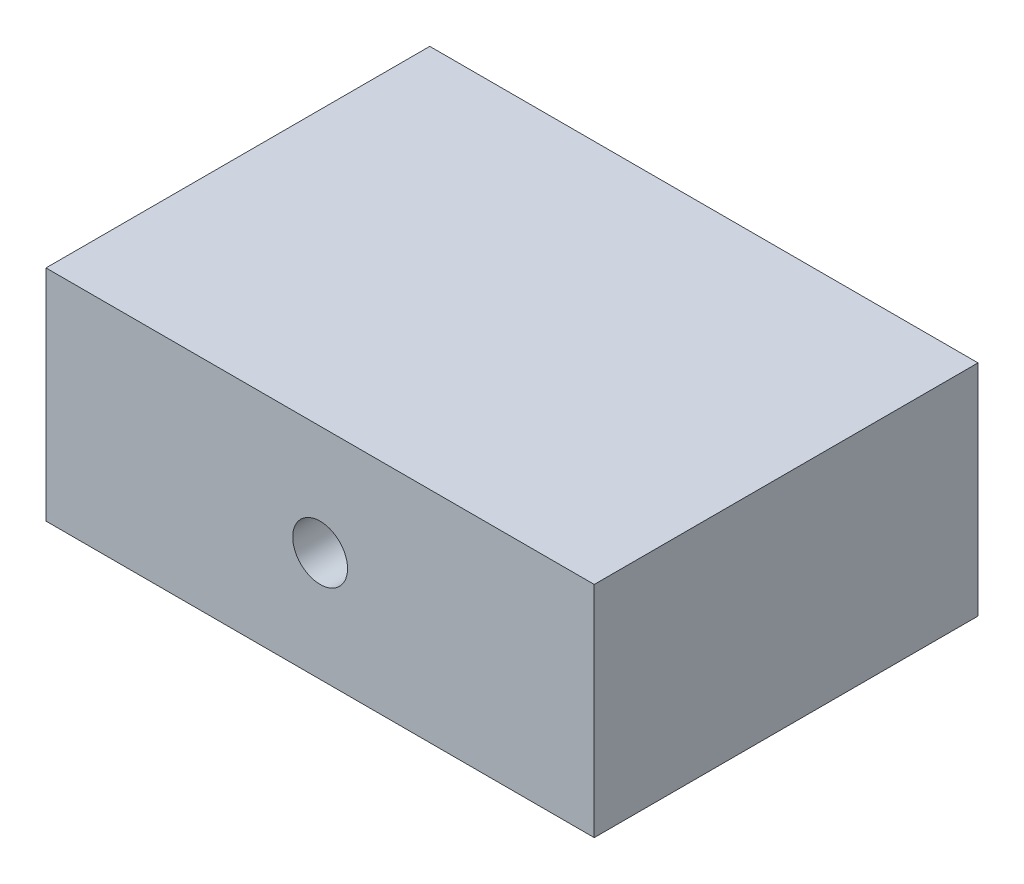
ISO-10303-21;
HEADER;
FILE_DESCRIPTION(('STEP AP214'),'2;1');
FILE_NAME('part.step','',(''),(''),'','','');
FILE_SCHEMA(('AUTOMOTIVE_DESIGN { 1 0 10303 214 1 1 1 1 }'));
ENDSEC;
DATA;
#1=APPLICATION_CONTEXT('core data for automotive mechanical design processes');
#2=APPLICATION_PROTOCOL_DEFINITION('international standard','automotive_design',2000,#1);
#3=PRODUCT_CONTEXT('',#1,'mechanical');
#4=PRODUCT('Part','Part','',(#3));
#5=PRODUCT_RELATED_PRODUCT_CATEGORY('part','',(#4));
#6=PRODUCT_DEFINITION_FORMATION('','',#4);
#7=PRODUCT_DEFINITION_CONTEXT('part definition',#1,'design');
#8=PRODUCT_DEFINITION('design','',#6,#7);
#9=PRODUCT_DEFINITION_SHAPE('','',#8);
#10=(LENGTH_UNIT() NAMED_UNIT(*) SI_UNIT(.MILLI.,.METRE.));
#11=(NAMED_UNIT(*) PLANE_ANGLE_UNIT() SI_UNIT($,.RADIAN.));
#12=(NAMED_UNIT(*) SI_UNIT($,.STERADIAN.) SOLID_ANGLE_UNIT());
#13=UNCERTAINTY_MEASURE_WITH_UNIT(LENGTH_MEASURE(1.E-05),#10,'distance_accuracy_value','');
#14=(GEOMETRIC_REPRESENTATION_CONTEXT(3) GLOBAL_UNCERTAINTY_ASSIGNED_CONTEXT((#13)) GLOBAL_UNIT_ASSIGNED_CONTEXT((#10,
#11,#12)) REPRESENTATION_CONTEXT('',''));
#15=CARTESIAN_POINT('',(0.,0.,0.));
#16=DIRECTION('',(0.,0.,1.));
#17=DIRECTION('',(1.,0.,0.));
#18=AXIS2_PLACEMENT_3D('',#15,#16,#17);
#19=CARTESIAN_POINT('',(0.,0.,350.));
#20=DIRECTION('',(0.,0.,1.));
#21=DIRECTION('',(1.,0.,0.));
#22=AXIS2_PLACEMENT_3D('',#19,#20,#21);
#23=PLANE('',#22);
#24=DIRECTION('',(0.,-1.,0.));
#25=VECTOR('',#24,1.);
#26=CARTESIAN_POINT('',(-250.,-100.,350.));
#27=LINE('',#26,#25);
#28=CARTESIAN_POINT('',(-250.,100.,350.));
#29=VERTEX_POINT('',#28);
#30=CARTESIAN_POINT('',(-250.,-100.,350.));
#31=VERTEX_POINT('',#30);
#32=EDGE_CURVE('E89',#29,#31,#27,.T.);
#33=ORIENTED_EDGE('',*,*,#32,.T.);
#34=DIRECTION('',(1.,0.,0.));
#35=VECTOR('',#34,1.);
#36=CARTESIAN_POINT('',(250.,-100.,350.));
#37=LINE('',#36,#35);
#38=CARTESIAN_POINT('',(250.,-100.,350.));
#39=VERTEX_POINT('',#38);
#40=EDGE_CURVE('E84',#31,#39,#37,.T.);
#41=ORIENTED_EDGE('',*,*,#40,.T.);
#42=DIRECTION('',(0.,1.,0.));
#43=VECTOR('',#42,1.);
#44=CARTESIAN_POINT('',(250.,-100.,350.));
#45=LINE('',#44,#43);
#46=CARTESIAN_POINT('',(250.,100.,350.));
#47=VERTEX_POINT('',#46);
#48=EDGE_CURVE('E87',#39,#47,#45,.T.);
#49=ORIENTED_EDGE('',*,*,#48,.T.);
#50=DIRECTION('',(-1.,0.,0.));
#51=VECTOR('',#50,1.);
#52=CARTESIAN_POINT('',(250.,100.,350.));
#53=LINE('',#52,#51);
#54=EDGE_CURVE('E54',#47,#29,#53,.T.);
#55=ORIENTED_EDGE('',*,*,#54,.T.);
#56=EDGE_LOOP('',(#33,#41,#49,#55));
#57=FACE_BOUND('',#56,.T.);
#58=CARTESIAN_POINT('',(0.,0.,350.));
#59=DIRECTION('',(0.,0.,1.));
#60=DIRECTION('',(1.,0.,0.));
#61=AXIS2_PLACEMENT_3D('',#58,#59,#60);
#62=CIRCLE('',#61,25.);
#63=CARTESIAN_POINT('',(25.,0.,350.));
#64=VERTEX_POINT('',#63);
#65=EDGE_CURVE('E104',#64,#64,#62,.T.);
#66=ORIENTED_EDGE('',*,*,#65,.F.);
#67=EDGE_LOOP('',(#66));
#68=FACE_BOUND('',#67,.T.);
#69=ADVANCED_FACE('F37',(#57,#68),#23,.T.);
#70=CARTESIAN_POINT('',(0.,0.,0.));
#71=DIRECTION('',(0.,0.,1.));
#72=DIRECTION('',(1.,0.,0.));
#73=AXIS2_PLACEMENT_3D('',#70,#71,#72);
#74=PLANE('',#73);
#75=DIRECTION('',(0.,-1.,0.));
#76=VECTOR('',#75,1.);
#77=CARTESIAN_POINT('',(-250.,-100.,0.));
#78=LINE('',#77,#76);
#79=CARTESIAN_POINT('',(-250.,100.,0.));
#80=VERTEX_POINT('',#79);
#81=CARTESIAN_POINT('',(-250.,-100.,0.));
#82=VERTEX_POINT('',#81);
#83=EDGE_CURVE('E101',#80,#82,#78,.T.);
#84=ORIENTED_EDGE('',*,*,#83,.F.);
#85=DIRECTION('',(-1.,0.,0.));
#86=VECTOR('',#85,1.);
#87=CARTESIAN_POINT('',(250.,100.,0.));
#88=LINE('',#87,#86);
#89=CARTESIAN_POINT('',(250.,100.,0.));
#90=VERTEX_POINT('',#89);
#91=EDGE_CURVE('E77',#90,#80,#88,.T.);
#92=ORIENTED_EDGE('',*,*,#91,.F.);
#93=DIRECTION('',(0.,1.,0.));
#94=VECTOR('',#93,1.);
#95=CARTESIAN_POINT('',(250.,-100.,0.));
#96=LINE('',#95,#94);
#97=CARTESIAN_POINT('',(250.,-100.,0.));
#98=VERTEX_POINT('',#97);
#99=EDGE_CURVE('E71',#98,#90,#96,.T.);
#100=ORIENTED_EDGE('',*,*,#99,.F.);
#101=DIRECTION('',(1.,0.,0.));
#102=VECTOR('',#101,1.);
#103=CARTESIAN_POINT('',(250.,-100.,0.));
#104=LINE('',#103,#102);
#105=EDGE_CURVE('E93',#82,#98,#104,.T.);
#106=ORIENTED_EDGE('',*,*,#105,.F.);
#107=EDGE_LOOP('',(#84,#92,#100,#106));
#108=FACE_BOUND('',#107,.T.);
#109=CARTESIAN_POINT('',(0.,0.,0.));
#110=DIRECTION('',(0.,0.,1.));
#111=DIRECTION('',(1.,0.,0.));
#112=AXIS2_PLACEMENT_3D('',#109,#110,#111);
#113=CIRCLE('',#112,25.);
#114=CARTESIAN_POINT('',(25.,0.,0.));
#115=VERTEX_POINT('',#114);
#116=EDGE_CURVE('E116',#115,#115,#113,.T.);
#117=ORIENTED_EDGE('',*,*,#116,.T.);
#118=EDGE_LOOP('',(#117));
#119=FACE_BOUND('',#118,.T.);
#120=ADVANCED_FACE('F112',(#108,#119),#74,.F.);
#121=CARTESIAN_POINT('',(-250.,-100.,350.));
#122=DIRECTION('',(1.,0.,0.));
#123=DIRECTION('',(0.,0.,-1.));
#124=AXIS2_PLACEMENT_3D('',#121,#122,#123);
#125=PLANE('',#124);
#126=ORIENTED_EDGE('',*,*,#83,.T.);
#127=DIRECTION('',(0.,0.,-1.));
#128=VECTOR('',#127,1.);
#129=CARTESIAN_POINT('',(-250.,-100.,350.));
#130=LINE('',#129,#128);
#131=EDGE_CURVE('E11',#31,#82,#130,.T.);
#132=ORIENTED_EDGE('',*,*,#131,.F.);
#133=ORIENTED_EDGE('',*,*,#32,.F.);
#134=DIRECTION('',(0.,0.,-1.));
#135=VECTOR('',#134,1.);
#136=CARTESIAN_POINT('',(-250.,100.,350.));
#137=LINE('',#136,#135);
#138=EDGE_CURVE('E97',#29,#80,#137,.T.);
#139=ORIENTED_EDGE('',*,*,#138,.T.);
#140=EDGE_LOOP('',(#126,#132,#133,#139));
#141=FACE_BOUND('',#140,.T.);
#142=ADVANCED_FACE('F39',(#141),#125,.F.);
#143=CARTESIAN_POINT('',(250.,-100.,350.));
#144=DIRECTION('',(0.,1.,0.));
#145=DIRECTION('',(-1.,0.,0.));
#146=AXIS2_PLACEMENT_3D('',#143,#144,#145);
#147=PLANE('',#146);
#148=ORIENTED_EDGE('',*,*,#105,.T.);
#149=DIRECTION('',(0.,0.,-1.));
#150=VECTOR('',#149,1.);
#151=CARTESIAN_POINT('',(250.,-100.,350.));
#152=LINE('',#151,#150);
#153=EDGE_CURVE('E46',#39,#98,#152,.T.);
#154=ORIENTED_EDGE('',*,*,#153,.F.);
#155=ORIENTED_EDGE('',*,*,#40,.F.);
#156=ORIENTED_EDGE('',*,*,#131,.T.);
#157=EDGE_LOOP('',(#148,#154,#155,#156));
#158=FACE_BOUND('',#157,.T.);
#159=ADVANCED_FACE('F92',(#158),#147,.F.);
#160=CARTESIAN_POINT('',(250.,-100.,350.));
#161=DIRECTION('',(-1.,0.,0.));
#162=DIRECTION('',(0.,0.,1.));
#163=AXIS2_PLACEMENT_3D('',#160,#161,#162);
#164=PLANE('',#163);
#165=ORIENTED_EDGE('',*,*,#99,.T.);
#166=DIRECTION('',(0.,0.,-1.));
#167=VECTOR('',#166,1.);
#168=CARTESIAN_POINT('',(250.,100.,350.));
#169=LINE('',#168,#167);
#170=EDGE_CURVE('E94',#47,#90,#169,.T.);
#171=ORIENTED_EDGE('',*,*,#170,.F.);
#172=ORIENTED_EDGE('',*,*,#48,.F.);
#173=ORIENTED_EDGE('',*,*,#153,.T.);
#174=EDGE_LOOP('',(#165,#171,#172,#173));
#175=FACE_BOUND('',#174,.T.);
#176=ADVANCED_FACE('F95',(#175),#164,.F.);
#177=CARTESIAN_POINT('',(250.,100.,350.));
#178=DIRECTION('',(0.,-1.,0.));
#179=DIRECTION('',(1.,0.,0.));
#180=AXIS2_PLACEMENT_3D('',#177,#178,#179);
#181=PLANE('',#180);
#182=ORIENTED_EDGE('',*,*,#91,.T.);
#183=ORIENTED_EDGE('',*,*,#138,.F.);
#184=ORIENTED_EDGE('',*,*,#54,.F.);
#185=ORIENTED_EDGE('',*,*,#170,.T.);
#186=EDGE_LOOP('',(#182,#183,#184,#185));
#187=FACE_BOUND('',#186,.T.);
#188=ADVANCED_FACE('F109',(#187),#181,.F.);
#189=CARTESIAN_POINT('',(0.,0.,350.));
#190=DIRECTION('',(0.,0.,-1.));
#191=DIRECTION('',(-1.,0.,0.));
#192=AXIS2_PLACEMENT_3D('',#189,#190,#191);
#193=CYLINDRICAL_SURFACE('',#192,25.);
#194=ORIENTED_EDGE('',*,*,#65,.T.);
#195=EDGE_LOOP('',(#194));
#196=FACE_BOUND('',#195,.T.);
#197=ORIENTED_EDGE('',*,*,#116,.F.);
#198=EDGE_LOOP('',(#197));
#199=FACE_BOUND('',#198,.T.);
#200=ADVANCED_FACE('F122',(#196,#199),#193,.F.);
#201=CLOSED_SHELL('',(#69,#120,#142,#159,#176,#188,#200));
#202=MANIFOLD_SOLID_BREP('B2',#201);
#203=ADVANCED_BREP_SHAPE_REPRESENTATION('',(#18,#202),#14);
#204=SHAPE_DEFINITION_REPRESENTATION(#9,#203);
ENDSEC;
END-ISO-10303-21;
